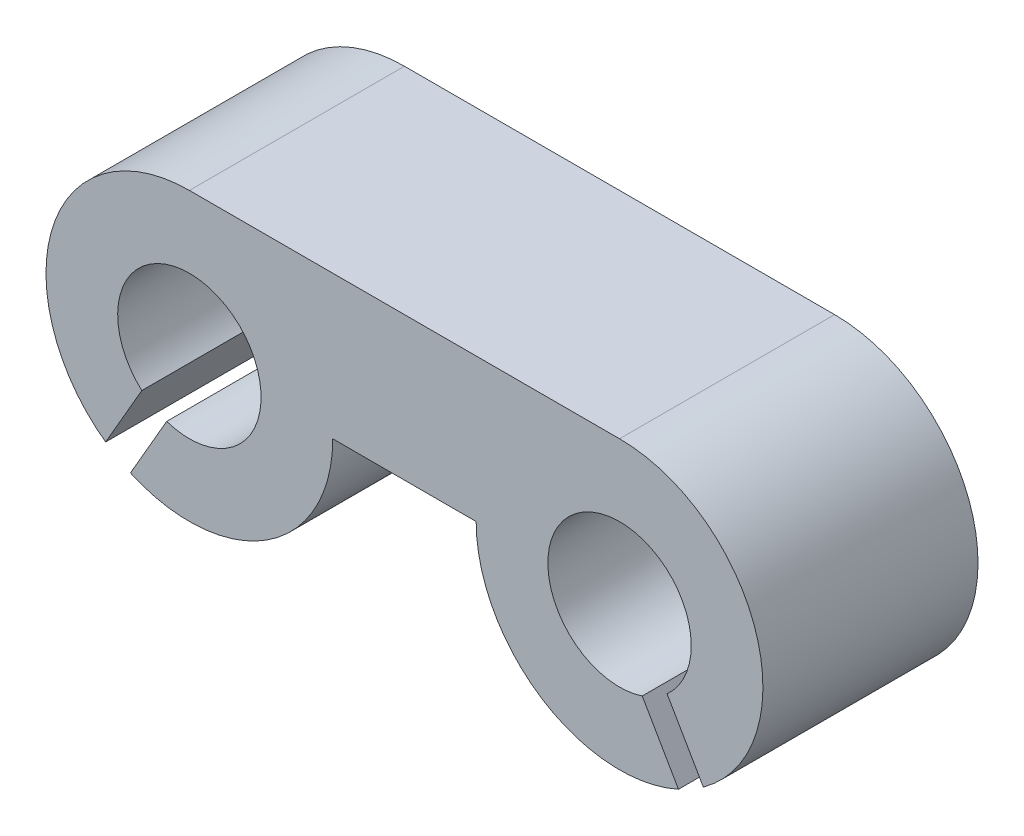
ISO-10303-21;
HEADER;
FILE_DESCRIPTION(('STEP AP214'),'2;1');
FILE_NAME('part.step','',(''),(''),'','','');
FILE_SCHEMA(('AUTOMOTIVE_DESIGN { 1 0 10303 214 1 1 1 1 }'));
ENDSEC;
DATA;
#1=APPLICATION_CONTEXT('core data for automotive mechanical design processes');
#2=APPLICATION_PROTOCOL_DEFINITION('international standard','automotive_design',2000,#1);
#3=PRODUCT_CONTEXT('',#1,'mechanical');
#4=PRODUCT('Part','Part','',(#3));
#5=PRODUCT_RELATED_PRODUCT_CATEGORY('part','',(#4));
#6=PRODUCT_DEFINITION_FORMATION('','',#4);
#7=PRODUCT_DEFINITION_CONTEXT('part definition',#1,'design');
#8=PRODUCT_DEFINITION('design','',#6,#7);
#9=PRODUCT_DEFINITION_SHAPE('','',#8);
#10=(LENGTH_UNIT() NAMED_UNIT(*) SI_UNIT(.MILLI.,.METRE.));
#11=(NAMED_UNIT(*) PLANE_ANGLE_UNIT() SI_UNIT($,.RADIAN.));
#12=(NAMED_UNIT(*) SI_UNIT($,.STERADIAN.) SOLID_ANGLE_UNIT());
#13=UNCERTAINTY_MEASURE_WITH_UNIT(LENGTH_MEASURE(1.E-05),#10,'distance_accuracy_value','');
#14=(GEOMETRIC_REPRESENTATION_CONTEXT(3) GLOBAL_UNCERTAINTY_ASSIGNED_CONTEXT((#13)) GLOBAL_UNIT_ASSIGNED_CONTEXT((#10,
#11,#12)) REPRESENTATION_CONTEXT('',''));
#15=CARTESIAN_POINT('',(0.,0.,0.));
#16=DIRECTION('',(0.,0.,1.));
#17=DIRECTION('',(1.,0.,0.));
#18=AXIS2_PLACEMENT_3D('',#15,#16,#17);
#19=CARTESIAN_POINT('',(15.,0.,15.));
#20=DIRECTION('',(0.,0.,-1.));
#21=DIRECTION('',(-1.,0.,0.));
#22=AXIS2_PLACEMENT_3D('',#19,#20,#21);
#23=CYLINDRICAL_SURFACE('',#22,10.);
#24=CARTESIAN_POINT('',(15.,0.,0.));
#25=DIRECTION('',(0.,0.,1.));
#26=DIRECTION('',(1.,0.,0.));
#27=AXIS2_PLACEMENT_3D('',#24,#25,#26);
#28=CIRCLE('',#27,10.);
#29=CARTESIAN_POINT('',(5.,0.,0.));
#30=VERTEX_POINT('',#29);
#31=CARTESIAN_POINT('',(19.1089117817486,-9.11684396980705,0.));
#32=VERTEX_POINT('',#31);
#33=EDGE_CURVE('E168',#30,#32,#28,.T.);
#34=ORIENTED_EDGE('',*,*,#33,.T.);
#35=DIRECTION('',(0.,0.,-1.));
#36=VECTOR('',#35,1.);
#37=CARTESIAN_POINT('',(19.1089117817486,-9.11684396980705,15.));
#38=LINE('',#37,#36);
#39=CARTESIAN_POINT('',(19.1089117817486,-9.11684396980705,15.));
#40=VERTEX_POINT('',#39);
#41=EDGE_CURVE('E206',#32,#40,#38,.F.);
#42=ORIENTED_EDGE('',*,*,#41,.T.);
#43=CARTESIAN_POINT('',(15.,0.,15.));
#44=DIRECTION('',(0.,0.,1.));
#45=DIRECTION('',(1.,0.,0.));
#46=AXIS2_PLACEMENT_3D('',#43,#44,#45);
#47=CIRCLE('',#46,10.);
#48=CARTESIAN_POINT('',(5.,0.,15.));
#49=VERTEX_POINT('',#48);
#50=EDGE_CURVE('E132',#49,#40,#47,.T.);
#51=ORIENTED_EDGE('',*,*,#50,.F.);
#52=DIRECTION('',(0.,0.,-1.));
#53=VECTOR('',#52,1.);
#54=CARTESIAN_POINT('',(5.,0.,15.));
#55=LINE('',#54,#53);
#56=EDGE_CURVE('E174',#49,#30,#55,.T.);
#57=ORIENTED_EDGE('',*,*,#56,.T.);
#58=EDGE_LOOP('',(#34,#42,#51,#57));
#59=FACE_BOUND('',#58,.T.);
#60=ADVANCED_FACE('F33',(#59),#23,.T.);
#61=CARTESIAN_POINT('',(-15.,0.,15.));
#62=DIRECTION('',(0.,0.,-1.));
#63=DIRECTION('',(-1.,0.,0.));
#64=AXIS2_PLACEMENT_3D('',#61,#62,#63);
#65=CYLINDRICAL_SURFACE('',#64,10.);
#66=CARTESIAN_POINT('',(-15.,0.,15.));
#67=DIRECTION('',(0.,0.,1.));
#68=DIRECTION('',(1.,0.,0.));
#69=AXIS2_PLACEMENT_3D('',#66,#67,#68);
#70=CIRCLE('',#69,10.);
#71=CARTESIAN_POINT('',(-19.1089117817487,-9.11684396980703,15.));
#72=VERTEX_POINT('',#71);
#73=CARTESIAN_POINT('',(-5.,0.,15.));
#74=VERTEX_POINT('',#73);
#75=EDGE_CURVE('E152',#72,#74,#70,.T.);
#76=ORIENTED_EDGE('',*,*,#75,.F.);
#77=DIRECTION('',(0.,0.,-1.));
#78=VECTOR('',#77,1.);
#79=CARTESIAN_POINT('',(-19.1089117817487,-9.11684396980702,15.));
#80=LINE('',#79,#78);
#81=CARTESIAN_POINT('',(-19.1089117817487,-9.11684396980703,0.));
#82=VERTEX_POINT('',#81);
#83=EDGE_CURVE('E136',#72,#82,#80,.T.);
#84=ORIENTED_EDGE('',*,*,#83,.T.);
#85=CARTESIAN_POINT('',(-15.,0.,0.));
#86=DIRECTION('',(0.,0.,1.));
#87=DIRECTION('',(1.,0.,0.));
#88=AXIS2_PLACEMENT_3D('',#85,#86,#87);
#89=CIRCLE('',#88,10.);
#90=CARTESIAN_POINT('',(-5.,0.,0.));
#91=VERTEX_POINT('',#90);
#92=EDGE_CURVE('E147',#82,#91,#89,.T.);
#93=ORIENTED_EDGE('',*,*,#92,.T.);
#94=DIRECTION('',(0.,0.,-1.));
#95=VECTOR('',#94,1.);
#96=CARTESIAN_POINT('',(-5.,0.,15.));
#97=LINE('',#96,#95);
#98=EDGE_CURVE('E177',#74,#91,#97,.T.);
#99=ORIENTED_EDGE('',*,*,#98,.F.);
#100=EDGE_LOOP('',(#76,#84,#93,#99));
#101=FACE_BOUND('',#100,.T.);
#102=ADVANCED_FACE('F234',(#101),#65,.T.);
#103=CARTESIAN_POINT('',(-15.,10.,0.));
#104=VERTEX_POINT('',#103);
#105=CARTESIAN_POINT('',(-20.8409625893176,-8.11684396980702,0.));
#106=VERTEX_POINT('',#105);
#107=EDGE_CURVE('E162',#104,#106,#89,.T.);
#108=ORIENTED_EDGE('',*,*,#107,.T.);
#109=DIRECTION('',(0.,0.,-1.));
#110=VECTOR('',#109,1.);
#111=CARTESIAN_POINT('',(-20.8409625893176,-8.11684396980702,15.));
#112=LINE('',#111,#110);
#113=CARTESIAN_POINT('',(-20.8409625893176,-8.11684396980702,15.));
#114=VERTEX_POINT('',#113);
#115=EDGE_CURVE('E141',#106,#114,#112,.F.);
#116=ORIENTED_EDGE('',*,*,#115,.T.);
#117=CARTESIAN_POINT('',(-15.,10.,15.));
#118=VERTEX_POINT('',#117);
#119=EDGE_CURVE('E154',#118,#114,#70,.T.);
#120=ORIENTED_EDGE('',*,*,#119,.F.);
#121=DIRECTION('',(0.,0.,-1.));
#122=VECTOR('',#121,1.);
#123=CARTESIAN_POINT('',(-15.,10.,15.));
#124=LINE('',#123,#122);
#125=EDGE_CURVE('E180',#118,#104,#124,.T.);
#126=ORIENTED_EDGE('',*,*,#125,.T.);
#127=EDGE_LOOP('',(#108,#116,#120,#126));
#128=FACE_BOUND('',#127,.T.);
#129=ADVANCED_FACE('F35',(#128),#65,.T.);
#130=CARTESIAN_POINT('',(-5.,0.,15.));
#131=DIRECTION('',(0.,1.,0.));
#132=DIRECTION('',(0.,0.,1.));
#133=AXIS2_PLACEMENT_3D('',#130,#131,#132);
#134=PLANE('',#133);
#135=DIRECTION('',(1.,0.,0.));
#136=VECTOR('',#135,1.);
#137=CARTESIAN_POINT('',(-5.,0.,0.));
#138=LINE('',#137,#136);
#139=EDGE_CURVE('E165',#91,#30,#138,.T.);
#140=ORIENTED_EDGE('',*,*,#139,.T.);
#141=ORIENTED_EDGE('',*,*,#56,.F.);
#142=DIRECTION('',(1.,0.,0.));
#143=VECTOR('',#142,1.);
#144=CARTESIAN_POINT('',(-5.,0.,15.));
#145=LINE('',#144,#143);
#146=EDGE_CURVE('E157',#74,#49,#145,.T.);
#147=ORIENTED_EDGE('',*,*,#146,.F.);
#148=ORIENTED_EDGE('',*,*,#98,.T.);
#149=EDGE_LOOP('',(#140,#141,#147,#148));
#150=FACE_BOUND('',#149,.T.);
#151=ADVANCED_FACE('F230',(#150),#134,.F.);
#152=CARTESIAN_POINT('',(20.8409625893175,-8.11684396980705,15.));
#153=VERTEX_POINT('',#152);
#154=CARTESIAN_POINT('',(15.,10.,15.));
#155=VERTEX_POINT('',#154);
#156=EDGE_CURVE('E159',#153,#155,#47,.T.);
#157=ORIENTED_EDGE('',*,*,#156,.F.);
#158=DIRECTION('',(0.,0.,-1.));
#159=VECTOR('',#158,1.);
#160=CARTESIAN_POINT('',(20.8409625893175,-8.11684396980705,15.));
#161=LINE('',#160,#159);
#162=CARTESIAN_POINT('',(20.8409625893175,-8.11684396980705,0.));
#163=VERTEX_POINT('',#162);
#164=EDGE_CURVE('E216',#153,#163,#161,.T.);
#165=ORIENTED_EDGE('',*,*,#164,.T.);
#166=CARTESIAN_POINT('',(15.,10.,0.));
#167=VERTEX_POINT('',#166);
#168=EDGE_CURVE('E167',#163,#167,#28,.T.);
#169=ORIENTED_EDGE('',*,*,#168,.T.);
#170=DIRECTION('',(0.,0.,-1.));
#171=VECTOR('',#170,1.);
#172=CARTESIAN_POINT('',(15.,10.,15.));
#173=LINE('',#172,#171);
#174=EDGE_CURVE('E161',#155,#167,#173,.T.);
#175=ORIENTED_EDGE('',*,*,#174,.F.);
#176=EDGE_LOOP('',(#157,#165,#169,#175));
#177=FACE_BOUND('',#176,.T.);
#178=ADVANCED_FACE('F249',(#177),#23,.T.);
#179=CARTESIAN_POINT('',(5.,10.,15.));
#180=DIRECTION('',(0.,-1.,0.));
#181=DIRECTION('',(1.,0.,0.));
#182=AXIS2_PLACEMENT_3D('',#179,#180,#181);
#183=PLANE('',#182);
#184=DIRECTION('',(-1.,0.,0.));
#185=VECTOR('',#184,1.);
#186=CARTESIAN_POINT('',(5.,10.,0.));
#187=LINE('',#186,#185);
#188=EDGE_CURVE('E153',#167,#104,#187,.T.);
#189=ORIENTED_EDGE('',*,*,#188,.T.);
#190=ORIENTED_EDGE('',*,*,#125,.F.);
#191=DIRECTION('',(-1.,0.,0.));
#192=VECTOR('',#191,1.);
#193=CARTESIAN_POINT('',(-5.,10.,15.));
#194=LINE('',#193,#192);
#195=EDGE_CURVE('E150',#155,#118,#194,.T.);
#196=ORIENTED_EDGE('',*,*,#195,.F.);
#197=ORIENTED_EDGE('',*,*,#174,.T.);
#198=EDGE_LOOP('',(#189,#190,#196,#197));
#199=FACE_BOUND('',#198,.T.);
#200=ADVANCED_FACE('F255',(#199),#183,.F.);
#201=CARTESIAN_POINT('',(15.,0.,15.));
#202=DIRECTION('',(0.,0.,1.));
#203=DIRECTION('',(1.,0.,0.));
#204=AXIS2_PLACEMENT_3D('',#201,#202,#203);
#205=PLANE('',#204);
#206=DIRECTION('',(0.499999999999998,-0.86602540378444,0.));
#207=VECTOR('',#206,1.);
#208=CARTESIAN_POINT('',(14.1339745962156,-0.499999999999997,15.));
#209=LINE('',#208,#207);
#210=CARTESIAN_POINT('',(16.5834643389987,-4.74264068711929,15.));
#211=VERTEX_POINT('',#210);
#212=EDGE_CURVE('E120',#211,#40,#209,.T.);
#213=ORIENTED_EDGE('',*,*,#212,.F.);
#214=CARTESIAN_POINT('',(15.,0.,15.));
#215=DIRECTION('',(0.,0.,1.));
#216=DIRECTION('',(1.,0.,0.));
#217=AXIS2_PLACEMENT_3D('',#214,#215,#216);
#218=CIRCLE('',#217,5.);
#219=CARTESIAN_POINT('',(18.3155151465676,-3.74264068711929,15.));
#220=VERTEX_POINT('',#219);
#221=EDGE_CURVE('E130',#220,#211,#218,.T.);
#222=ORIENTED_EDGE('',*,*,#221,.F.);
#223=DIRECTION('',(-0.499999999999998,0.86602540378444,0.));
#224=VECTOR('',#223,1.);
#225=CARTESIAN_POINT('',(15.8660254037844,0.499999999999998,15.));
#226=LINE('',#225,#224);
#227=EDGE_CURVE('E48',#153,#220,#226,.T.);
#228=ORIENTED_EDGE('',*,*,#227,.F.);
#229=ORIENTED_EDGE('',*,*,#156,.T.);
#230=ORIENTED_EDGE('',*,*,#195,.T.);
#231=ORIENTED_EDGE('',*,*,#119,.T.);
#232=DIRECTION('',(-0.500000000000004,-0.866025403784436,0.));
#233=VECTOR('',#232,1.);
#234=CARTESIAN_POINT('',(-15.8660254037844,0.500000000000004,15.));
#235=LINE('',#234,#233);
#236=CARTESIAN_POINT('',(-18.3155151465676,-3.74264068711927,15.));
#237=VERTEX_POINT('',#236);
#238=EDGE_CURVE('E198',#237,#114,#235,.T.);
#239=ORIENTED_EDGE('',*,*,#238,.F.);
#240=CARTESIAN_POINT('',(-15.,0.,15.));
#241=DIRECTION('',(0.,0.,1.));
#242=DIRECTION('',(1.,0.,0.));
#243=AXIS2_PLACEMENT_3D('',#240,#241,#242);
#244=CIRCLE('',#243,5.);
#245=CARTESIAN_POINT('',(-16.5834643389988,-4.74264068711928,15.));
#246=VERTEX_POINT('',#245);
#247=EDGE_CURVE('E138',#246,#237,#244,.T.);
#248=ORIENTED_EDGE('',*,*,#247,.F.);
#249=DIRECTION('',(0.500000000000004,0.866025403784436,0.));
#250=VECTOR('',#249,1.);
#251=CARTESIAN_POINT('',(-14.1339745962156,-0.500000000000002,15.));
#252=LINE('',#251,#250);
#253=EDGE_CURVE('E196',#72,#246,#252,.T.);
#254=ORIENTED_EDGE('',*,*,#253,.F.);
#255=ORIENTED_EDGE('',*,*,#75,.T.);
#256=ORIENTED_EDGE('',*,*,#146,.T.);
#257=ORIENTED_EDGE('',*,*,#50,.T.);
#258=EDGE_LOOP('',(#213,#222,#228,#229,#230,#231,#239,#248,#254,#255,#256,#257));
#259=FACE_BOUND('',#258,.T.);
#260=ADVANCED_FACE('F129',(#259),#205,.T.);
#261=CARTESIAN_POINT('',(15.,0.,0.));
#262=DIRECTION('',(0.,0.,1.));
#263=DIRECTION('',(1.,0.,0.));
#264=AXIS2_PLACEMENT_3D('',#261,#262,#263);
#265=PLANE('',#264);
#266=CARTESIAN_POINT('',(15.,0.,0.));
#267=DIRECTION('',(0.,0.,1.));
#268=DIRECTION('',(1.,0.,0.));
#269=AXIS2_PLACEMENT_3D('',#266,#267,#268);
#270=CIRCLE('',#269,5.);
#271=CARTESIAN_POINT('',(18.3155151465676,-3.74264068711929,0.));
#272=VERTEX_POINT('',#271);
#273=CARTESIAN_POINT('',(16.5834643389987,-4.74264068711929,0.));
#274=VERTEX_POINT('',#273);
#275=EDGE_CURVE('E135',#272,#274,#270,.T.);
#276=ORIENTED_EDGE('',*,*,#275,.T.);
#277=DIRECTION('',(0.499999999999998,-0.86602540378444,0.));
#278=VECTOR('',#277,1.);
#279=CARTESIAN_POINT('',(14.1339745962156,-0.499999999999997,0.));
#280=LINE('',#279,#278);
#281=EDGE_CURVE('E56',#274,#32,#280,.T.);
#282=ORIENTED_EDGE('',*,*,#281,.T.);
#283=ORIENTED_EDGE('',*,*,#33,.F.);
#284=ORIENTED_EDGE('',*,*,#139,.F.);
#285=ORIENTED_EDGE('',*,*,#92,.F.);
#286=DIRECTION('',(0.500000000000004,0.866025403784436,0.));
#287=VECTOR('',#286,1.);
#288=CARTESIAN_POINT('',(-14.1339745962156,-0.500000000000002,0.));
#289=LINE('',#288,#287);
#290=CARTESIAN_POINT('',(-16.5834643389988,-4.74264068711928,0.));
#291=VERTEX_POINT('',#290);
#292=EDGE_CURVE('E202',#82,#291,#289,.T.);
#293=ORIENTED_EDGE('',*,*,#292,.T.);
#294=CARTESIAN_POINT('',(-15.,0.,0.));
#295=DIRECTION('',(0.,0.,1.));
#296=DIRECTION('',(1.,0.,0.));
#297=AXIS2_PLACEMENT_3D('',#294,#295,#296);
#298=CIRCLE('',#297,5.);
#299=CARTESIAN_POINT('',(-18.3155151465676,-3.74264068711927,0.));
#300=VERTEX_POINT('',#299);
#301=EDGE_CURVE('E144',#291,#300,#298,.T.);
#302=ORIENTED_EDGE('',*,*,#301,.T.);
#303=DIRECTION('',(-0.500000000000004,-0.866025403784436,0.));
#304=VECTOR('',#303,1.);
#305=CARTESIAN_POINT('',(-15.8660254037844,0.500000000000004,0.));
#306=LINE('',#305,#304);
#307=EDGE_CURVE('E204',#300,#106,#306,.T.);
#308=ORIENTED_EDGE('',*,*,#307,.T.);
#309=ORIENTED_EDGE('',*,*,#107,.F.);
#310=ORIENTED_EDGE('',*,*,#188,.F.);
#311=ORIENTED_EDGE('',*,*,#168,.F.);
#312=DIRECTION('',(-0.499999999999998,0.86602540378444,0.));
#313=VECTOR('',#312,1.);
#314=CARTESIAN_POINT('',(15.8660254037844,0.499999999999998,0.));
#315=LINE('',#314,#313);
#316=EDGE_CURVE('E219',#163,#272,#315,.T.);
#317=ORIENTED_EDGE('',*,*,#316,.T.);
#318=EDGE_LOOP('',(#276,#282,#283,#284,#285,#293,#302,#308,#309,#310,#311,#317));
#319=FACE_BOUND('',#318,.T.);
#320=ADVANCED_FACE('F224',(#319),#265,.F.);
#321=CARTESIAN_POINT('',(-15.,0.,0.));
#322=DIRECTION('',(0.,0.,1.));
#323=DIRECTION('',(1.,0.,0.));
#324=AXIS2_PLACEMENT_3D('',#321,#322,#323);
#325=CYLINDRICAL_SURFACE('',#324,5.);
#326=ORIENTED_EDGE('',*,*,#301,.F.);
#327=DIRECTION('',(0.,0.,1.));
#328=VECTOR('',#327,1.);
#329=CARTESIAN_POINT('',(-16.5834643389988,-4.74264068711928,0.));
#330=LINE('',#329,#328);
#331=EDGE_CURVE('E186',#291,#246,#330,.T.);
#332=ORIENTED_EDGE('',*,*,#331,.T.);
#333=ORIENTED_EDGE('',*,*,#247,.T.);
#334=DIRECTION('',(0.,0.,1.));
#335=VECTOR('',#334,1.);
#336=CARTESIAN_POINT('',(-18.3155151465676,-3.74264068711927,0.));
#337=LINE('',#336,#335);
#338=EDGE_CURVE('E183',#237,#300,#337,.F.);
#339=ORIENTED_EDGE('',*,*,#338,.T.);
#340=EDGE_LOOP('',(#326,#332,#333,#339));
#341=FACE_BOUND('',#340,.T.);
#342=ADVANCED_FACE('F191',(#341),#325,.F.);
#343=CARTESIAN_POINT('',(15.,0.,0.));
#344=DIRECTION('',(0.,0.,1.));
#345=DIRECTION('',(1.,0.,0.));
#346=AXIS2_PLACEMENT_3D('',#343,#344,#345);
#347=CYLINDRICAL_SURFACE('',#346,5.);
#348=ORIENTED_EDGE('',*,*,#221,.T.);
#349=DIRECTION('',(0.,0.,1.));
#350=VECTOR('',#349,1.);
#351=CARTESIAN_POINT('',(16.5834643389987,-4.74264068711929,0.));
#352=LINE('',#351,#350);
#353=EDGE_CURVE('E11',#211,#274,#352,.F.);
#354=ORIENTED_EDGE('',*,*,#353,.T.);
#355=ORIENTED_EDGE('',*,*,#275,.F.);
#356=DIRECTION('',(0.,0.,1.));
#357=VECTOR('',#356,1.);
#358=CARTESIAN_POINT('',(18.3155151465676,-3.74264068711929,0.));
#359=LINE('',#358,#357);
#360=EDGE_CURVE('E41',#272,#220,#359,.T.);
#361=ORIENTED_EDGE('',*,*,#360,.T.);
#362=EDGE_LOOP('',(#348,#354,#355,#361));
#363=FACE_BOUND('',#362,.T.);
#364=ADVANCED_FACE('F134',(#363),#347,.F.);
#365=CARTESIAN_POINT('',(-15.8660254037844,0.500000000000004,0.));
#366=DIRECTION('',(-0.866025403784436,0.500000000000004,0.));
#367=DIRECTION('',(-0.500000000000004,-0.866025403784437,0.));
#368=AXIS2_PLACEMENT_3D('',#365,#366,#367);
#369=PLANE('',#368);
#370=ORIENTED_EDGE('',*,*,#307,.F.);
#371=ORIENTED_EDGE('',*,*,#338,.F.);
#372=ORIENTED_EDGE('',*,*,#238,.T.);
#373=ORIENTED_EDGE('',*,*,#115,.F.);
#374=EDGE_LOOP('',(#370,#371,#372,#373));
#375=FACE_BOUND('',#374,.T.);
#376=ADVANCED_FACE('F238',(#375),#369,.F.);
#377=CARTESIAN_POINT('',(-14.1339745962156,-0.500000000000002,0.));
#378=DIRECTION('',(0.866025403784436,-0.500000000000004,0.));
#379=DIRECTION('',(0.500000000000004,0.866025403784436,0.));
#380=AXIS2_PLACEMENT_3D('',#377,#378,#379);
#381=PLANE('',#380);
#382=ORIENTED_EDGE('',*,*,#253,.T.);
#383=ORIENTED_EDGE('',*,*,#331,.F.);
#384=ORIENTED_EDGE('',*,*,#292,.F.);
#385=ORIENTED_EDGE('',*,*,#83,.F.);
#386=EDGE_LOOP('',(#382,#383,#384,#385));
#387=FACE_BOUND('',#386,.T.);
#388=ADVANCED_FACE('F235',(#387),#381,.F.);
#389=CARTESIAN_POINT('',(15.8660254037844,0.499999999999998,0.));
#390=DIRECTION('',(0.86602540378444,0.499999999999998,0.));
#391=DIRECTION('',(-0.499999999999998,0.86602540378444,0.));
#392=AXIS2_PLACEMENT_3D('',#389,#390,#391);
#393=PLANE('',#392);
#394=ORIENTED_EDGE('',*,*,#227,.T.);
#395=ORIENTED_EDGE('',*,*,#360,.F.);
#396=ORIENTED_EDGE('',*,*,#316,.F.);
#397=ORIENTED_EDGE('',*,*,#164,.F.);
#398=EDGE_LOOP('',(#394,#395,#396,#397));
#399=FACE_BOUND('',#398,.T.);
#400=ADVANCED_FACE('F237',(#399),#393,.F.);
#401=CARTESIAN_POINT('',(14.1339745962156,-0.499999999999997,0.));
#402=DIRECTION('',(-0.86602540378444,-0.499999999999998,0.));
#403=DIRECTION('',(0.499999999999998,-0.86602540378444,0.));
#404=AXIS2_PLACEMENT_3D('',#401,#402,#403);
#405=PLANE('',#404);
#406=ORIENTED_EDGE('',*,*,#281,.F.);
#407=ORIENTED_EDGE('',*,*,#353,.F.);
#408=ORIENTED_EDGE('',*,*,#212,.T.);
#409=ORIENTED_EDGE('',*,*,#41,.F.);
#410=EDGE_LOOP('',(#406,#407,#408,#409));
#411=FACE_BOUND('',#410,.T.);
#412=ADVANCED_FACE('F119',(#411),#405,.F.);
#413=CLOSED_SHELL('',(#60,#102,#129,#151,#178,#200,#260,#320,#342,#364,#376,#388,#400,#412));
#414=MANIFOLD_SOLID_BREP('B2',#413);
#415=ADVANCED_BREP_SHAPE_REPRESENTATION('',(#18,#414),#14);
#416=SHAPE_DEFINITION_REPRESENTATION(#9,#415);
ENDSEC;
END-ISO-10303-21;
